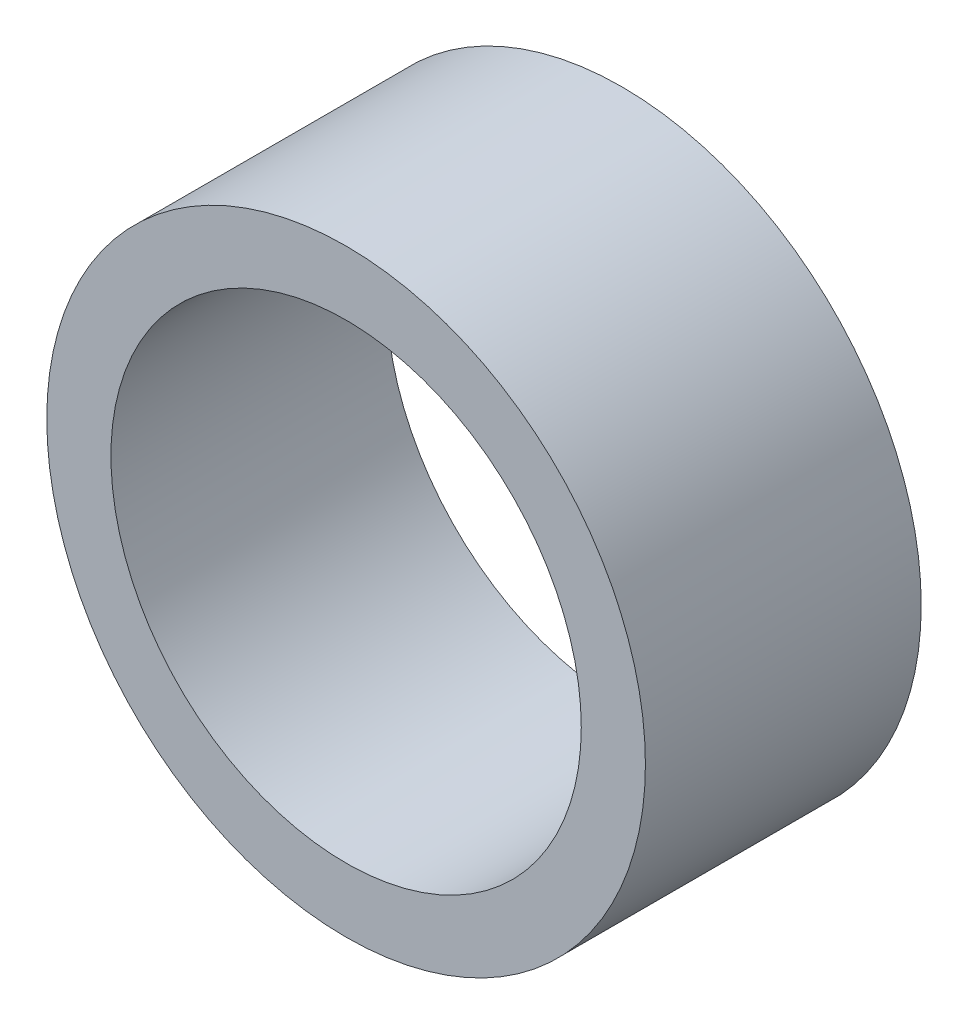
ISO-10303-21;
HEADER;
FILE_DESCRIPTION(('STEP AP214'),'2;1');
FILE_NAME('part.step','',(''),(''),'','','');
FILE_SCHEMA(('AUTOMOTIVE_DESIGN { 1 0 10303 214 1 1 1 1 }'));
ENDSEC;
DATA;
#1=APPLICATION_CONTEXT('core data for automotive mechanical design processes');
#2=APPLICATION_PROTOCOL_DEFINITION('international standard','automotive_design',2000,#1);
#3=PRODUCT_CONTEXT('',#1,'mechanical');
#4=PRODUCT('Part','Part','',(#3));
#5=PRODUCT_RELATED_PRODUCT_CATEGORY('part','',(#4));
#6=PRODUCT_DEFINITION_FORMATION('','',#4);
#7=PRODUCT_DEFINITION_CONTEXT('part definition',#1,'design');
#8=PRODUCT_DEFINITION('design','',#6,#7);
#9=PRODUCT_DEFINITION_SHAPE('','',#8);
#10=(LENGTH_UNIT() NAMED_UNIT(*) SI_UNIT(.MILLI.,.METRE.));
#11=(NAMED_UNIT(*) PLANE_ANGLE_UNIT() SI_UNIT($,.RADIAN.));
#12=(NAMED_UNIT(*) SI_UNIT($,.STERADIAN.) SOLID_ANGLE_UNIT());
#13=UNCERTAINTY_MEASURE_WITH_UNIT(LENGTH_MEASURE(1.E-05),#10,'distance_accuracy_value','');
#14=(GEOMETRIC_REPRESENTATION_CONTEXT(3) GLOBAL_UNCERTAINTY_ASSIGNED_CONTEXT((#13)) GLOBAL_UNIT_ASSIGNED_CONTEXT((#10,
#11,#12)) REPRESENTATION_CONTEXT('',''));
#15=CARTESIAN_POINT('',(0.,0.,0.));
#16=DIRECTION('',(0.,0.,1.));
#17=DIRECTION('',(1.,0.,0.));
#18=AXIS2_PLACEMENT_3D('',#15,#16,#17);
#19=CARTESIAN_POINT('',(0.,0.,19.));
#20=DIRECTION('',(0.,0.,-1.));
#21=DIRECTION('',(-1.,0.,0.));
#22=AXIS2_PLACEMENT_3D('',#19,#20,#21);
#23=CYLINDRICAL_SURFACE('',#22,14.);
#24=CARTESIAN_POINT('',(0.,0.,18.));
#25=DIRECTION('',(0.,0.,1.));
#26=DIRECTION('',(1.,0.,0.));
#27=AXIS2_PLACEMENT_3D('',#24,#25,#26);
#28=CIRCLE('',#27,14.);
#29=CARTESIAN_POINT('',(14.,0.,18.));
#30=VERTEX_POINT('',#29);
#31=EDGE_CURVE('E18',#30,#30,#28,.T.);
#32=ORIENTED_EDGE('',*,*,#31,.F.);
#33=EDGE_LOOP('',(#32));
#34=FACE_BOUND('',#33,.T.);
#35=CARTESIAN_POINT('',(0.,0.,5.1));
#36=DIRECTION('',(0.,0.,-1.));
#37=DIRECTION('',(-1.,0.,0.));
#38=AXIS2_PLACEMENT_3D('',#35,#36,#37);
#39=CIRCLE('',#38,14.);
#40=CARTESIAN_POINT('',(-14.,0.,5.1));
#41=VERTEX_POINT('',#40);
#42=EDGE_CURVE('E32',#41,#41,#39,.T.);
#43=ORIENTED_EDGE('',*,*,#42,.F.);
#44=EDGE_LOOP('',(#43));
#45=FACE_BOUND('',#44,.T.);
#46=ADVANCED_FACE('F14',(#34,#45),#23,.T.);
#47=CARTESIAN_POINT('',(14.,0.,18.));
#48=DIRECTION('',(0.,0.,1.));
#49=DIRECTION('',(1.,0.,0.));
#50=AXIS2_PLACEMENT_3D('',#47,#48,#49);
#51=PLANE('',#50);
#52=CARTESIAN_POINT('',(0.,0.,18.));
#53=DIRECTION('',(0.,0.,1.));
#54=DIRECTION('',(1.,0.,0.));
#55=AXIS2_PLACEMENT_3D('',#52,#53,#54);
#56=CIRCLE('',#55,11.);
#57=CARTESIAN_POINT('',(11.,0.,18.));
#58=VERTEX_POINT('',#57);
#59=EDGE_CURVE('E23',#58,#58,#56,.F.);
#60=ORIENTED_EDGE('',*,*,#59,.T.);
#61=EDGE_LOOP('',(#60));
#62=FACE_BOUND('',#61,.T.);
#63=ORIENTED_EDGE('',*,*,#31,.T.);
#64=EDGE_LOOP('',(#63));
#65=FACE_BOUND('',#64,.T.);
#66=ADVANCED_FACE('F46',(#62,#65),#51,.T.);
#67=CARTESIAN_POINT('',(0.,0.,2.));
#68=DIRECTION('',(0.,0.,1.));
#69=DIRECTION('',(1.,0.,0.));
#70=AXIS2_PLACEMENT_3D('',#67,#68,#69);
#71=CYLINDRICAL_SURFACE('',#70,11.);
#72=ORIENTED_EDGE('',*,*,#59,.F.);
#73=EDGE_LOOP('',(#72));
#74=FACE_BOUND('',#73,.T.);
#75=CARTESIAN_POINT('',(0.,0.,5.1));
#76=DIRECTION('',(0.,0.,-1.));
#77=DIRECTION('',(-1.,0.,0.));
#78=AXIS2_PLACEMENT_3D('',#75,#76,#77);
#79=CIRCLE('',#78,11.);
#80=CARTESIAN_POINT('',(-11.,0.,5.1));
#81=VERTEX_POINT('',#80);
#82=EDGE_CURVE('E10',#81,#81,#79,.F.);
#83=ORIENTED_EDGE('',*,*,#82,.F.);
#84=EDGE_LOOP('',(#83));
#85=FACE_BOUND('',#84,.T.);
#86=ADVANCED_FACE('F55',(#74,#85),#71,.F.);
#87=CARTESIAN_POINT('',(14.,14.,5.1));
#88=DIRECTION('',(0.,0.,-1.));
#89=DIRECTION('',(-1.,0.,0.));
#90=AXIS2_PLACEMENT_3D('',#87,#88,#89);
#91=PLANE('',#90);
#92=ORIENTED_EDGE('',*,*,#82,.T.);
#93=EDGE_LOOP('',(#92));
#94=FACE_BOUND('',#93,.T.);
#95=ORIENTED_EDGE('',*,*,#42,.T.);
#96=EDGE_LOOP('',(#95));
#97=FACE_BOUND('',#96,.T.);
#98=ADVANCED_FACE('F16',(#94,#97),#91,.T.);
#99=CLOSED_SHELL('',(#46,#66,#86,#98));
#100=MANIFOLD_SOLID_BREP('B1',#99);
#101=ADVANCED_BREP_SHAPE_REPRESENTATION('',(#18,#100),#14);
#102=SHAPE_DEFINITION_REPRESENTATION(#9,#101);
ENDSEC;
END-ISO-10303-21;
